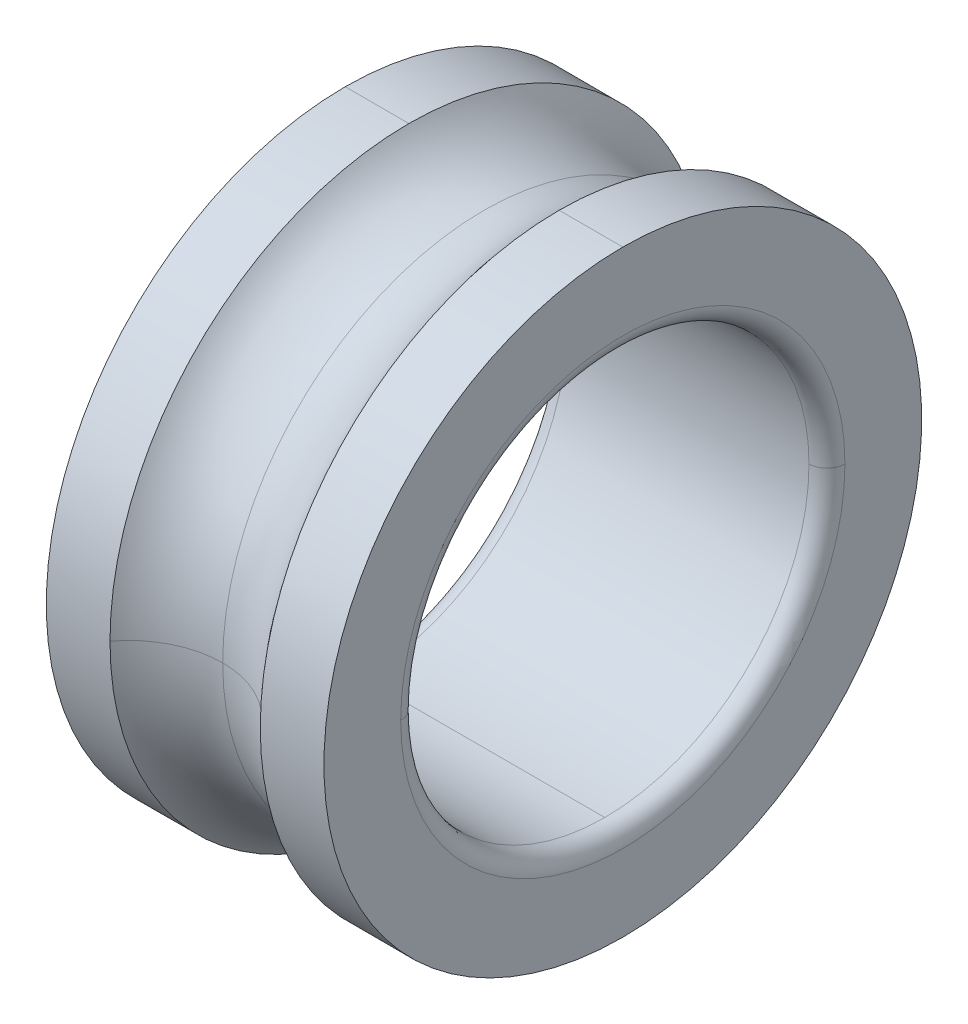
ISO-10303-21;
HEADER;
FILE_DESCRIPTION(('STEP AP214'),'2;1');
FILE_NAME('part.step','',(''),(''),'','','');
FILE_SCHEMA(('AUTOMOTIVE_DESIGN { 1 0 10303 214 1 1 1 1 }'));
ENDSEC;
DATA;
#1=APPLICATION_CONTEXT('core data for automotive mechanical design processes');
#2=APPLICATION_PROTOCOL_DEFINITION('international standard','automotive_design',2000,#1);
#3=PRODUCT_CONTEXT('',#1,'mechanical');
#4=PRODUCT('Part','Part','',(#3));
#5=PRODUCT_RELATED_PRODUCT_CATEGORY('part','',(#4));
#6=PRODUCT_DEFINITION_FORMATION('','',#4);
#7=PRODUCT_DEFINITION_CONTEXT('part definition',#1,'design');
#8=PRODUCT_DEFINITION('design','',#6,#7);
#9=PRODUCT_DEFINITION_SHAPE('','',#8);
#10=(LENGTH_UNIT() NAMED_UNIT(*) SI_UNIT(.MILLI.,.METRE.));
#11=(NAMED_UNIT(*) PLANE_ANGLE_UNIT() SI_UNIT($,.RADIAN.));
#12=(NAMED_UNIT(*) SI_UNIT($,.STERADIAN.) SOLID_ANGLE_UNIT());
#13=UNCERTAINTY_MEASURE_WITH_UNIT(LENGTH_MEASURE(1.E-05),#10,'distance_accuracy_value','');
#14=(GEOMETRIC_REPRESENTATION_CONTEXT(3) GLOBAL_UNCERTAINTY_ASSIGNED_CONTEXT((#13)) GLOBAL_UNIT_ASSIGNED_CONTEXT((#10,
#11,#12)) REPRESENTATION_CONTEXT('',''));
#15=CARTESIAN_POINT('',(0.,0.,0.));
#16=DIRECTION('',(0.,0.,1.));
#17=DIRECTION('',(1.,0.,0.));
#18=AXIS2_PLACEMENT_3D('',#15,#16,#17);
#19=CARTESIAN_POINT('',(15.05,0.,0.));
#20=DIRECTION('',(1.,0.,0.));
#21=DIRECTION('',(0.,1.,0.));
#22=AXIS2_PLACEMENT_3D('',#19,#20,#21);
#23=CYLINDRICAL_SURFACE('',#22,18.3);
#24=DIRECTION('',(1.,0.,0.));
#25=VECTOR('',#24,1.);
#26=CARTESIAN_POINT('',(15.05,18.3,0.));
#27=LINE('',#26,#25);
#28=CARTESIAN_POINT('',(13.1,18.3,0.));
#29=VERTEX_POINT('',#28);
#30=CARTESIAN_POINT('',(17.,18.3,0.));
#31=VERTEX_POINT('',#30);
#32=EDGE_CURVE('E158',#29,#31,#27,.T.);
#33=ORIENTED_EDGE('',*,*,#32,.T.);
#34=CARTESIAN_POINT('',(17.,0.,0.));
#35=DIRECTION('',(1.,0.,0.));
#36=DIRECTION('',(0.,1.,0.));
#37=AXIS2_PLACEMENT_3D('',#34,#35,#36);
#38=CIRCLE('',#37,18.3);
#39=CARTESIAN_POINT('',(17.,-18.3,0.));
#40=VERTEX_POINT('',#39);
#41=EDGE_CURVE('E153',#40,#31,#38,.T.);
#42=ORIENTED_EDGE('',*,*,#41,.F.);
#43=DIRECTION('',(-1.,0.,0.));
#44=VECTOR('',#43,1.);
#45=CARTESIAN_POINT('',(15.05,-18.3,0.));
#46=LINE('',#45,#44);
#47=CARTESIAN_POINT('',(13.1,-18.3,0.));
#48=VERTEX_POINT('',#47);
#49=EDGE_CURVE('E166',#40,#48,#46,.T.);
#50=ORIENTED_EDGE('',*,*,#49,.T.);
#51=CARTESIAN_POINT('',(13.1,0.,0.));
#52=DIRECTION('',(1.,0.,0.));
#53=DIRECTION('',(0.,1.,0.));
#54=AXIS2_PLACEMENT_3D('',#51,#52,#53);
#55=CIRCLE('',#54,18.3);
#56=CARTESIAN_POINT('',(13.1,0.,-18.3));
#57=VERTEX_POINT('',#56);
#58=EDGE_CURVE('E132',#48,#57,#55,.T.);
#59=ORIENTED_EDGE('',*,*,#58,.T.);
#60=CARTESIAN_POINT('',(13.1,0.,0.));
#61=DIRECTION('',(1.,0.,0.));
#62=DIRECTION('',(0.,1.,0.));
#63=AXIS2_PLACEMENT_3D('',#60,#61,#62);
#64=CIRCLE('',#63,18.3);
#65=EDGE_CURVE('E156',#57,#29,#64,.T.);
#66=ORIENTED_EDGE('',*,*,#65,.T.);
#67=EDGE_LOOP('',(#33,#42,#50,#59,#66));
#68=FACE_BOUND('',#67,.T.);
#69=ADVANCED_FACE('F16',(#68),#23,.T.);
#70=CARTESIAN_POINT('',(8.5,0.,0.));
#71=DIRECTION('',(1.,0.,0.));
#72=DIRECTION('',(0.,0.,-1.));
#73=AXIS2_PLACEMENT_3D('',#70,#71,#72);
#74=TOROIDAL_SURFACE('',#73,21.75,5.75);
#75=CARTESIAN_POINT('',(8.5,0.,0.));
#76=DIRECTION('',(-1.,0.,0.));
#77=DIRECTION('',(0.,0.,1.));
#78=AXIS2_PLACEMENT_3D('',#75,#76,#77);
#79=CIRCLE('',#78,16.);
#80=CARTESIAN_POINT('',(8.5,0.,16.));
#81=VERTEX_POINT('',#80);
#82=CARTESIAN_POINT('',(8.5,0.,-16.));
#83=VERTEX_POINT('',#82);
#84=EDGE_CURVE('E114',#81,#83,#79,.T.);
#85=ORIENTED_EDGE('',*,*,#84,.T.);
#86=CARTESIAN_POINT('',(8.5,0.,-21.75));
#87=DIRECTION('',(0.,-1.,0.));
#88=DIRECTION('',(0.,0.,-1.));
#89=AXIS2_PLACEMENT_3D('',#86,#87,#88);
#90=CIRCLE('',#89,5.75);
#91=CARTESIAN_POINT('',(3.9,0.,-18.3));
#92=VERTEX_POINT('',#91);
#93=EDGE_CURVE('E128',#83,#92,#90,.T.);
#94=ORIENTED_EDGE('',*,*,#93,.T.);
#95=CARTESIAN_POINT('',(3.9,0.,0.));
#96=DIRECTION('',(1.,0.,0.));
#97=DIRECTION('',(0.,1.,0.));
#98=AXIS2_PLACEMENT_3D('',#95,#96,#97);
#99=CIRCLE('',#98,18.3);
#100=CARTESIAN_POINT('',(3.9,18.3,0.));
#101=VERTEX_POINT('',#100);
#102=EDGE_CURVE('E11',#92,#101,#99,.T.);
#103=ORIENTED_EDGE('',*,*,#102,.T.);
#104=CARTESIAN_POINT('',(3.9,0.,0.));
#105=DIRECTION('',(1.,0.,0.));
#106=DIRECTION('',(0.,1.,0.));
#107=AXIS2_PLACEMENT_3D('',#104,#105,#106);
#108=CIRCLE('',#107,18.3);
#109=CARTESIAN_POINT('',(3.9,0.,18.3));
#110=VERTEX_POINT('',#109);
#111=EDGE_CURVE('E116',#101,#110,#108,.T.);
#112=ORIENTED_EDGE('',*,*,#111,.T.);
#113=CARTESIAN_POINT('',(8.5,0.,21.75));
#114=DIRECTION('',(0.,-1.,0.));
#115=DIRECTION('',(0.,0.,1.));
#116=AXIS2_PLACEMENT_3D('',#113,#114,#115);
#117=CIRCLE('',#116,5.75);
#118=EDGE_CURVE('E109',#110,#81,#117,.T.);
#119=ORIENTED_EDGE('',*,*,#118,.T.);
#120=EDGE_LOOP('',(#85,#94,#103,#112,#119));
#121=FACE_BOUND('',#120,.T.);
#122=ADVANCED_FACE('F111',(#121),#74,.F.);
#123=CARTESIAN_POINT('',(1.95,0.,0.));
#124=DIRECTION('',(1.,0.,0.));
#125=DIRECTION('',(0.,1.,0.));
#126=AXIS2_PLACEMENT_3D('',#123,#124,#125);
#127=CYLINDRICAL_SURFACE('',#126,18.3);
#128=DIRECTION('',(1.,0.,0.));
#129=VECTOR('',#128,1.);
#130=CARTESIAN_POINT('',(1.95,18.3,0.));
#131=LINE('',#130,#129);
#132=CARTESIAN_POINT('',(0.,18.3,0.));
#133=VERTEX_POINT('',#132);
#134=EDGE_CURVE('E161',#133,#101,#131,.T.);
#135=ORIENTED_EDGE('',*,*,#134,.T.);
#136=ORIENTED_EDGE('',*,*,#102,.F.);
#137=CARTESIAN_POINT('',(3.9,0.,0.));
#138=DIRECTION('',(1.,0.,0.));
#139=DIRECTION('',(0.,1.,0.));
#140=AXIS2_PLACEMENT_3D('',#137,#138,#139);
#141=CIRCLE('',#140,18.3);
#142=CARTESIAN_POINT('',(3.9,-18.3,0.));
#143=VERTEX_POINT('',#142);
#144=EDGE_CURVE('E169',#143,#92,#141,.T.);
#145=ORIENTED_EDGE('',*,*,#144,.F.);
#146=DIRECTION('',(-1.,0.,0.));
#147=VECTOR('',#146,1.);
#148=CARTESIAN_POINT('',(1.95,-18.3,0.));
#149=LINE('',#148,#147);
#150=CARTESIAN_POINT('',(0.,-18.3,0.));
#151=VERTEX_POINT('',#150);
#152=EDGE_CURVE('E181',#143,#151,#149,.T.);
#153=ORIENTED_EDGE('',*,*,#152,.T.);
#154=CARTESIAN_POINT('',(0.,0.,0.));
#155=DIRECTION('',(1.,0.,0.));
#156=DIRECTION('',(0.,1.,0.));
#157=AXIS2_PLACEMENT_3D('',#154,#155,#156);
#158=CIRCLE('',#157,18.3);
#159=EDGE_CURVE('E23',#151,#133,#158,.T.);
#160=ORIENTED_EDGE('',*,*,#159,.T.);
#161=EDGE_LOOP('',(#135,#136,#145,#153,#160));
#162=FACE_BOUND('',#161,.T.);
#163=ADVANCED_FACE('F225',(#162),#127,.T.);
#164=CARTESIAN_POINT('',(0.,15.95,0.));
#165=DIRECTION('',(-1.,0.,0.));
#166=DIRECTION('',(0.,0.,1.));
#167=AXIS2_PLACEMENT_3D('',#164,#165,#166);
#168=PLANE('',#167);
#169=CARTESIAN_POINT('',(0.,0.,0.));
#170=DIRECTION('',(1.,0.,0.));
#171=DIRECTION('',(0.,1.,0.));
#172=AXIS2_PLACEMENT_3D('',#169,#170,#171);
#173=CIRCLE('',#172,13.6);
#174=CARTESIAN_POINT('',(0.,0.,13.6));
#175=VERTEX_POINT('',#174);
#176=CARTESIAN_POINT('',(0.,0.,-13.6));
#177=VERTEX_POINT('',#176);
#178=EDGE_CURVE('E172',#175,#177,#173,.T.);
#179=ORIENTED_EDGE('',*,*,#178,.T.);
#180=CARTESIAN_POINT('',(0.,0.,0.));
#181=DIRECTION('',(1.,0.,0.));
#182=DIRECTION('',(0.,1.,0.));
#183=AXIS2_PLACEMENT_3D('',#180,#181,#182);
#184=CIRCLE('',#183,13.6);
#185=EDGE_CURVE('E197',#177,#175,#184,.T.);
#186=ORIENTED_EDGE('',*,*,#185,.T.);
#187=EDGE_LOOP('',(#179,#186));
#188=FACE_BOUND('',#187,.T.);
#189=CARTESIAN_POINT('',(0.,0.,0.));
#190=DIRECTION('',(1.,0.,0.));
#191=DIRECTION('',(0.,1.,0.));
#192=AXIS2_PLACEMENT_3D('',#189,#190,#191);
#193=CIRCLE('',#192,18.3);
#194=EDGE_CURVE('E164',#133,#151,#193,.T.);
#195=ORIENTED_EDGE('',*,*,#194,.F.);
#196=ORIENTED_EDGE('',*,*,#159,.F.);
#197=EDGE_LOOP('',(#195,#196));
#198=FACE_BOUND('',#197,.T.);
#199=ADVANCED_FACE('F229',(#188,#198),#168,.T.);
#200=CARTESIAN_POINT('',(1.1,0.,0.));
#201=DIRECTION('',(1.,0.,0.));
#202=DIRECTION('',(0.,0.,-1.));
#203=AXIS2_PLACEMENT_3D('',#200,#201,#202);
#204=TOROIDAL_SURFACE('',#203,13.6,1.1);
#205=CARTESIAN_POINT('',(1.1,0.,-13.6));
#206=DIRECTION('',(0.,-1.,0.));
#207=DIRECTION('',(0.,0.,-1.));
#208=AXIS2_PLACEMENT_3D('',#205,#206,#207);
#209=CIRCLE('',#208,1.1);
#210=CARTESIAN_POINT('',(1.1,0.,-12.5));
#211=VERTEX_POINT('',#210);
#212=EDGE_CURVE('E185',#211,#177,#209,.T.);
#213=ORIENTED_EDGE('',*,*,#212,.T.);
#214=ORIENTED_EDGE('',*,*,#178,.F.);
#215=CARTESIAN_POINT('',(1.1,0.,13.6));
#216=DIRECTION('',(0.,-1.,0.));
#217=DIRECTION('',(0.,0.,1.));
#218=AXIS2_PLACEMENT_3D('',#215,#216,#217);
#219=CIRCLE('',#218,1.1);
#220=CARTESIAN_POINT('',(1.1,0.,12.5));
#221=VERTEX_POINT('',#220);
#222=EDGE_CURVE('E194',#175,#221,#219,.T.);
#223=ORIENTED_EDGE('',*,*,#222,.T.);
#224=CARTESIAN_POINT('',(1.1,0.,0.));
#225=DIRECTION('',(1.,0.,0.));
#226=DIRECTION('',(0.,1.,0.));
#227=AXIS2_PLACEMENT_3D('',#224,#225,#226);
#228=CIRCLE('',#227,12.5);
#229=CARTESIAN_POINT('',(1.1,-12.5,0.));
#230=VERTEX_POINT('',#229);
#231=EDGE_CURVE('E170',#221,#230,#228,.T.);
#232=ORIENTED_EDGE('',*,*,#231,.T.);
#233=CARTESIAN_POINT('',(1.1,0.,0.));
#234=DIRECTION('',(1.,0.,0.));
#235=DIRECTION('',(0.,1.,0.));
#236=AXIS2_PLACEMENT_3D('',#233,#234,#235);
#237=CIRCLE('',#236,12.5);
#238=EDGE_CURVE('E203',#230,#211,#237,.T.);
#239=ORIENTED_EDGE('',*,*,#238,.T.);
#240=EDGE_LOOP('',(#213,#214,#223,#232,#239));
#241=FACE_BOUND('',#240,.T.);
#242=ADVANCED_FACE('F274',(#241),#204,.T.);
#243=CARTESIAN_POINT('',(8.5,0.,0.));
#244=DIRECTION('',(1.,0.,0.));
#245=DIRECTION('',(0.,1.,0.));
#246=AXIS2_PLACEMENT_3D('',#243,#244,#245);
#247=CYLINDRICAL_SURFACE('',#246,12.5);
#248=DIRECTION('',(1.,0.,0.));
#249=VECTOR('',#248,1.);
#250=CARTESIAN_POINT('',(8.5,12.5,0.));
#251=LINE('',#250,#249);
#252=CARTESIAN_POINT('',(1.1,12.5,0.));
#253=VERTEX_POINT('',#252);
#254=CARTESIAN_POINT('',(15.9,12.5,0.));
#255=VERTEX_POINT('',#254);
#256=EDGE_CURVE('E200',#253,#255,#251,.T.);
#257=ORIENTED_EDGE('',*,*,#256,.T.);
#258=CARTESIAN_POINT('',(15.9,0.,0.));
#259=DIRECTION('',(1.,0.,0.));
#260=DIRECTION('',(0.,1.,0.));
#261=AXIS2_PLACEMENT_3D('',#258,#259,#260);
#262=CIRCLE('',#261,12.5);
#263=CARTESIAN_POINT('',(15.9,0.,12.5));
#264=VERTEX_POINT('',#263);
#265=EDGE_CURVE('E151',#255,#264,#262,.T.);
#266=ORIENTED_EDGE('',*,*,#265,.T.);
#267=CARTESIAN_POINT('',(15.9,0.,0.));
#268=DIRECTION('',(1.,0.,0.));
#269=DIRECTION('',(0.,1.,0.));
#270=AXIS2_PLACEMENT_3D('',#267,#268,#269);
#271=CIRCLE('',#270,12.5);
#272=CARTESIAN_POINT('',(15.9,-12.5,0.));
#273=VERTEX_POINT('',#272);
#274=EDGE_CURVE('E30',#264,#273,#271,.T.);
#275=ORIENTED_EDGE('',*,*,#274,.T.);
#276=DIRECTION('',(-1.,0.,0.));
#277=VECTOR('',#276,1.);
#278=CARTESIAN_POINT('',(8.5,-12.5,0.));
#279=LINE('',#278,#277);
#280=EDGE_CURVE('E205',#273,#230,#279,.T.);
#281=ORIENTED_EDGE('',*,*,#280,.T.);
#282=ORIENTED_EDGE('',*,*,#231,.F.);
#283=CARTESIAN_POINT('',(1.1,0.,0.));
#284=DIRECTION('',(1.,0.,0.));
#285=DIRECTION('',(0.,1.,0.));
#286=AXIS2_PLACEMENT_3D('',#283,#284,#285);
#287=CIRCLE('',#286,12.5);
#288=EDGE_CURVE('E191',#253,#221,#287,.T.);
#289=ORIENTED_EDGE('',*,*,#288,.F.);
#290=EDGE_LOOP('',(#257,#266,#275,#281,#282,#289));
#291=FACE_BOUND('',#290,.T.);
#292=ADVANCED_FACE('F267',(#291),#247,.F.);
#293=CARTESIAN_POINT('',(15.9,0.,0.));
#294=DIRECTION('',(1.,0.,0.));
#295=DIRECTION('',(0.,0.,-1.));
#296=AXIS2_PLACEMENT_3D('',#293,#294,#295);
#297=TOROIDAL_SURFACE('',#296,13.6,1.1);
#298=CARTESIAN_POINT('',(15.9,0.,-13.6));
#299=DIRECTION('',(0.,-1.,0.));
#300=DIRECTION('',(0.,0.,-1.));
#301=AXIS2_PLACEMENT_3D('',#298,#299,#300);
#302=CIRCLE('',#301,1.1);
#303=CARTESIAN_POINT('',(17.,0.,-13.6));
#304=VERTEX_POINT('',#303);
#305=CARTESIAN_POINT('',(15.9,0.,-12.5));
#306=VERTEX_POINT('',#305);
#307=EDGE_CURVE('E214',#304,#306,#302,.T.);
#308=ORIENTED_EDGE('',*,*,#307,.T.);
#309=CARTESIAN_POINT('',(15.9,0.,0.));
#310=DIRECTION('',(1.,0.,0.));
#311=DIRECTION('',(0.,1.,0.));
#312=AXIS2_PLACEMENT_3D('',#309,#310,#311);
#313=CIRCLE('',#312,12.5);
#314=EDGE_CURVE('E208',#273,#306,#313,.T.);
#315=ORIENTED_EDGE('',*,*,#314,.F.);
#316=ORIENTED_EDGE('',*,*,#274,.F.);
#317=CARTESIAN_POINT('',(15.9,0.,13.6));
#318=DIRECTION('',(0.,-1.,0.));
#319=DIRECTION('',(0.,0.,1.));
#320=AXIS2_PLACEMENT_3D('',#317,#318,#319);
#321=CIRCLE('',#320,1.1);
#322=CARTESIAN_POINT('',(17.,0.,13.6));
#323=VERTEX_POINT('',#322);
#324=EDGE_CURVE('E154',#264,#323,#321,.T.);
#325=ORIENTED_EDGE('',*,*,#324,.T.);
#326=CARTESIAN_POINT('',(17.,0.,0.));
#327=DIRECTION('',(1.,0.,0.));
#328=DIRECTION('',(0.,1.,0.));
#329=AXIS2_PLACEMENT_3D('',#326,#327,#328);
#330=CIRCLE('',#329,13.6);
#331=EDGE_CURVE('E37',#323,#304,#330,.T.);
#332=ORIENTED_EDGE('',*,*,#331,.T.);
#333=EDGE_LOOP('',(#308,#315,#316,#325,#332));
#334=FACE_BOUND('',#333,.T.);
#335=ADVANCED_FACE('F259',(#334),#297,.T.);
#336=CARTESIAN_POINT('',(17.,15.95,0.));
#337=DIRECTION('',(1.,0.,0.));
#338=DIRECTION('',(0.,1.,0.));
#339=AXIS2_PLACEMENT_3D('',#336,#337,#338);
#340=PLANE('',#339);
#341=CARTESIAN_POINT('',(17.,0.,0.));
#342=DIRECTION('',(1.,0.,0.));
#343=DIRECTION('',(0.,1.,0.));
#344=AXIS2_PLACEMENT_3D('',#341,#342,#343);
#345=CIRCLE('',#344,13.6);
#346=EDGE_CURVE('E216',#304,#323,#345,.T.);
#347=ORIENTED_EDGE('',*,*,#346,.F.);
#348=ORIENTED_EDGE('',*,*,#331,.F.);
#349=EDGE_LOOP('',(#347,#348));
#350=FACE_BOUND('',#349,.T.);
#351=CARTESIAN_POINT('',(17.,0.,0.));
#352=DIRECTION('',(1.,0.,0.));
#353=DIRECTION('',(0.,1.,0.));
#354=AXIS2_PLACEMENT_3D('',#351,#352,#353);
#355=CIRCLE('',#354,18.3);
#356=EDGE_CURVE('E121',#31,#40,#355,.T.);
#357=ORIENTED_EDGE('',*,*,#356,.T.);
#358=ORIENTED_EDGE('',*,*,#41,.T.);
#359=EDGE_LOOP('',(#357,#358));
#360=FACE_BOUND('',#359,.T.);
#361=ADVANCED_FACE('F256',(#350,#360),#340,.T.);
#362=CARTESIAN_POINT('',(15.9,0.,0.));
#363=DIRECTION('',(1.,0.,0.));
#364=DIRECTION('',(0.,0.,-1.));
#365=AXIS2_PLACEMENT_3D('',#362,#363,#364);
#366=TOROIDAL_SURFACE('',#365,13.6,1.1);
#367=ORIENTED_EDGE('',*,*,#307,.F.);
#368=ORIENTED_EDGE('',*,*,#346,.T.);
#369=ORIENTED_EDGE('',*,*,#324,.F.);
#370=ORIENTED_EDGE('',*,*,#265,.F.);
#371=CARTESIAN_POINT('',(15.9,0.,0.));
#372=DIRECTION('',(1.,0.,0.));
#373=DIRECTION('',(0.,1.,0.));
#374=AXIS2_PLACEMENT_3D('',#371,#372,#373);
#375=CIRCLE('',#374,12.5);
#376=EDGE_CURVE('E211',#306,#255,#375,.T.);
#377=ORIENTED_EDGE('',*,*,#376,.F.);
#378=EDGE_LOOP('',(#367,#368,#369,#370,#377));
#379=FACE_BOUND('',#378,.T.);
#380=ADVANCED_FACE('F258',(#379),#366,.T.);
#381=CARTESIAN_POINT('',(8.5,0.,0.));
#382=DIRECTION('',(1.,0.,0.));
#383=DIRECTION('',(0.,1.,0.));
#384=AXIS2_PLACEMENT_3D('',#381,#382,#383);
#385=CYLINDRICAL_SURFACE('',#384,12.5);
#386=ORIENTED_EDGE('',*,*,#256,.F.);
#387=CARTESIAN_POINT('',(1.1,0.,0.));
#388=DIRECTION('',(1.,0.,0.));
#389=DIRECTION('',(0.,1.,0.));
#390=AXIS2_PLACEMENT_3D('',#387,#388,#389);
#391=CIRCLE('',#390,12.5);
#392=EDGE_CURVE('E188',#211,#253,#391,.T.);
#393=ORIENTED_EDGE('',*,*,#392,.F.);
#394=ORIENTED_EDGE('',*,*,#238,.F.);
#395=ORIENTED_EDGE('',*,*,#280,.F.);
#396=ORIENTED_EDGE('',*,*,#314,.T.);
#397=ORIENTED_EDGE('',*,*,#376,.T.);
#398=EDGE_LOOP('',(#386,#393,#394,#395,#396,#397));
#399=FACE_BOUND('',#398,.T.);
#400=ADVANCED_FACE('F242',(#399),#385,.F.);
#401=CARTESIAN_POINT('',(1.1,0.,0.));
#402=DIRECTION('',(1.,0.,0.));
#403=DIRECTION('',(0.,0.,-1.));
#404=AXIS2_PLACEMENT_3D('',#401,#402,#403);
#405=TOROIDAL_SURFACE('',#404,13.6,1.1);
#406=ORIENTED_EDGE('',*,*,#212,.F.);
#407=ORIENTED_EDGE('',*,*,#392,.T.);
#408=ORIENTED_EDGE('',*,*,#288,.T.);
#409=ORIENTED_EDGE('',*,*,#222,.F.);
#410=ORIENTED_EDGE('',*,*,#185,.F.);
#411=EDGE_LOOP('',(#406,#407,#408,#409,#410));
#412=FACE_BOUND('',#411,.T.);
#413=ADVANCED_FACE('F233',(#412),#405,.T.);
#414=CARTESIAN_POINT('',(1.95,0.,0.));
#415=DIRECTION('',(1.,0.,0.));
#416=DIRECTION('',(0.,1.,0.));
#417=AXIS2_PLACEMENT_3D('',#414,#415,#416);
#418=CYLINDRICAL_SURFACE('',#417,18.3);
#419=ORIENTED_EDGE('',*,*,#134,.F.);
#420=ORIENTED_EDGE('',*,*,#194,.T.);
#421=ORIENTED_EDGE('',*,*,#152,.F.);
#422=CARTESIAN_POINT('',(3.9,0.,0.));
#423=DIRECTION('',(1.,0.,0.));
#424=DIRECTION('',(0.,1.,0.));
#425=AXIS2_PLACEMENT_3D('',#422,#423,#424);
#426=CIRCLE('',#425,18.3);
#427=EDGE_CURVE('E120',#110,#143,#426,.T.);
#428=ORIENTED_EDGE('',*,*,#427,.F.);
#429=ORIENTED_EDGE('',*,*,#111,.F.);
#430=EDGE_LOOP('',(#419,#420,#421,#428,#429));
#431=FACE_BOUND('',#430,.T.);
#432=ADVANCED_FACE('F231',(#431),#418,.T.);
#433=CARTESIAN_POINT('',(8.5,0.,0.));
#434=DIRECTION('',(1.,0.,0.));
#435=DIRECTION('',(0.,0.,-1.));
#436=AXIS2_PLACEMENT_3D('',#433,#434,#435);
#437=TOROIDAL_SURFACE('',#436,21.75,5.75);
#438=CARTESIAN_POINT('',(8.5,0.,0.));
#439=DIRECTION('',(-1.,0.,0.));
#440=DIRECTION('',(0.,0.,1.));
#441=AXIS2_PLACEMENT_3D('',#438,#439,#440);
#442=CIRCLE('',#441,16.);
#443=EDGE_CURVE('E124',#83,#81,#442,.T.);
#444=ORIENTED_EDGE('',*,*,#443,.T.);
#445=ORIENTED_EDGE('',*,*,#118,.F.);
#446=ORIENTED_EDGE('',*,*,#427,.T.);
#447=ORIENTED_EDGE('',*,*,#144,.T.);
#448=ORIENTED_EDGE('',*,*,#93,.F.);
#449=EDGE_LOOP('',(#444,#445,#446,#447,#448));
#450=FACE_BOUND('',#449,.T.);
#451=ADVANCED_FACE('F126',(#450),#437,.F.);
#452=CARTESIAN_POINT('',(15.05,0.,0.));
#453=DIRECTION('',(1.,0.,0.));
#454=DIRECTION('',(0.,1.,0.));
#455=AXIS2_PLACEMENT_3D('',#452,#453,#454);
#456=CYLINDRICAL_SURFACE('',#455,18.3);
#457=ORIENTED_EDGE('',*,*,#32,.F.);
#458=CARTESIAN_POINT('',(13.1,0.,0.));
#459=DIRECTION('',(1.,0.,0.));
#460=DIRECTION('',(0.,1.,0.));
#461=AXIS2_PLACEMENT_3D('',#458,#459,#460);
#462=CIRCLE('',#461,18.3);
#463=CARTESIAN_POINT('',(13.1,0.,18.3));
#464=VERTEX_POINT('',#463);
#465=EDGE_CURVE('E144',#29,#464,#462,.T.);
#466=ORIENTED_EDGE('',*,*,#465,.T.);
#467=CARTESIAN_POINT('',(13.1,0.,0.));
#468=DIRECTION('',(1.,0.,0.));
#469=DIRECTION('',(0.,1.,0.));
#470=AXIS2_PLACEMENT_3D('',#467,#468,#469);
#471=CIRCLE('',#470,18.3);
#472=EDGE_CURVE('E140',#464,#48,#471,.T.);
#473=ORIENTED_EDGE('',*,*,#472,.T.);
#474=ORIENTED_EDGE('',*,*,#49,.F.);
#475=ORIENTED_EDGE('',*,*,#356,.F.);
#476=EDGE_LOOP('',(#457,#466,#473,#474,#475));
#477=FACE_BOUND('',#476,.T.);
#478=ADVANCED_FACE('F240',(#477),#456,.T.);
#479=CARTESIAN_POINT('',(8.5,0.,0.));
#480=DIRECTION('',(1.,0.,0.));
#481=DIRECTION('',(0.,0.,-1.));
#482=AXIS2_PLACEMENT_3D('',#479,#480,#481);
#483=TOROIDAL_SURFACE('',#482,21.75,5.75);
#484=ORIENTED_EDGE('',*,*,#443,.F.);
#485=CARTESIAN_POINT('',(8.5,0.,-21.75));
#486=DIRECTION('',(0.,-1.,0.));
#487=DIRECTION('',(0.,0.,-1.));
#488=AXIS2_PLACEMENT_3D('',#485,#486,#487);
#489=CIRCLE('',#488,5.75);
#490=EDGE_CURVE('E133',#57,#83,#489,.T.);
#491=ORIENTED_EDGE('',*,*,#490,.F.);
#492=ORIENTED_EDGE('',*,*,#58,.F.);
#493=ORIENTED_EDGE('',*,*,#472,.F.);
#494=CARTESIAN_POINT('',(8.5,0.,21.75));
#495=DIRECTION('',(0.,-1.,0.));
#496=DIRECTION('',(0.,0.,1.));
#497=AXIS2_PLACEMENT_3D('',#494,#495,#496);
#498=CIRCLE('',#497,5.75);
#499=EDGE_CURVE('E136',#81,#464,#498,.T.);
#500=ORIENTED_EDGE('',*,*,#499,.F.);
#501=EDGE_LOOP('',(#484,#491,#492,#493,#500));
#502=FACE_BOUND('',#501,.T.);
#503=ADVANCED_FACE('F137',(#502),#483,.F.);
#504=CARTESIAN_POINT('',(8.5,0.,0.));
#505=DIRECTION('',(1.,0.,0.));
#506=DIRECTION('',(0.,0.,-1.));
#507=AXIS2_PLACEMENT_3D('',#504,#505,#506);
#508=TOROIDAL_SURFACE('',#507,21.75,5.75);
#509=ORIENTED_EDGE('',*,*,#84,.F.);
#510=ORIENTED_EDGE('',*,*,#499,.T.);
#511=ORIENTED_EDGE('',*,*,#465,.F.);
#512=ORIENTED_EDGE('',*,*,#65,.F.);
#513=ORIENTED_EDGE('',*,*,#490,.T.);
#514=EDGE_LOOP('',(#509,#510,#511,#512,#513));
#515=FACE_BOUND('',#514,.T.);
#516=ADVANCED_FACE('F146',(#515),#508,.F.);
#517=CLOSED_SHELL('',(#69,#122,#163,#199,#242,#292,#335,#361,#380,#400,#413,#432,#451,#478,#503,#516));
#518=MANIFOLD_SOLID_BREP('B1',#517);
#519=ADVANCED_BREP_SHAPE_REPRESENTATION('',(#18,#518),#14);
#520=SHAPE_DEFINITION_REPRESENTATION(#9,#519);
ENDSEC;
END-ISO-10303-21;
